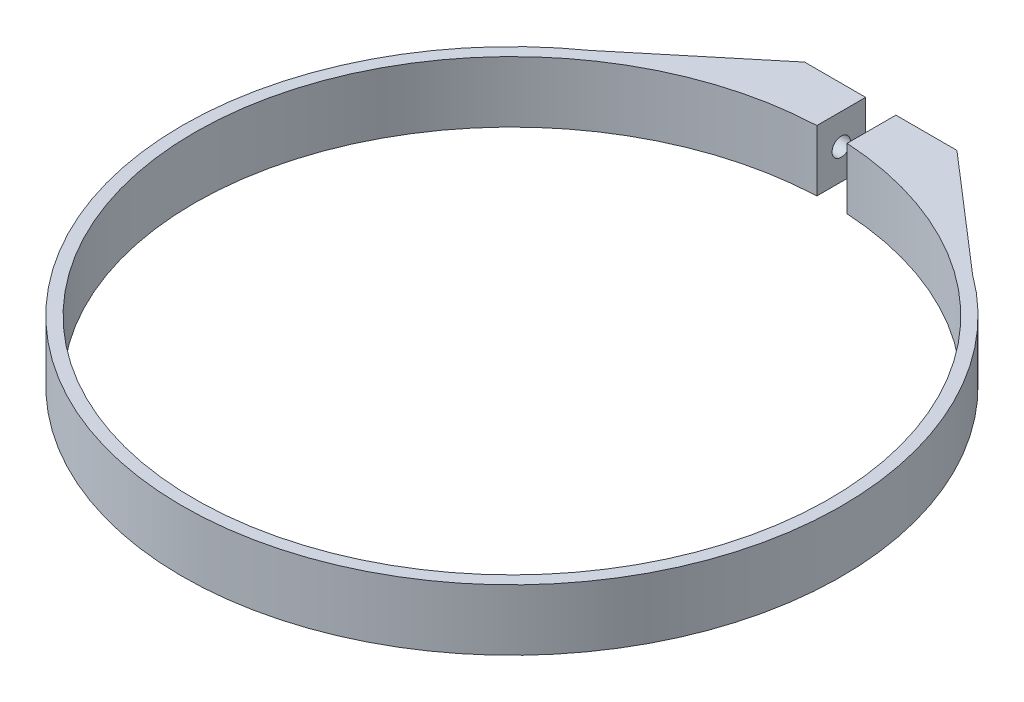
ISO-10303-21;
HEADER;
FILE_DESCRIPTION(('STEP AP214'),'2;1');
FILE_NAME('part.step','',(''),(''),'','','');
FILE_SCHEMA(('AUTOMOTIVE_DESIGN { 1 0 10303 214 1 1 1 1 }'));
ENDSEC;
DATA;
#1=APPLICATION_CONTEXT('core data for automotive mechanical design processes');
#2=APPLICATION_PROTOCOL_DEFINITION('international standard','automotive_design',2000,#1);
#3=PRODUCT_CONTEXT('',#1,'mechanical');
#4=PRODUCT('Part','Part','',(#3));
#5=PRODUCT_RELATED_PRODUCT_CATEGORY('part','',(#4));
#6=PRODUCT_DEFINITION_FORMATION('','',#4);
#7=PRODUCT_DEFINITION_CONTEXT('part definition',#1,'design');
#8=PRODUCT_DEFINITION('design','',#6,#7);
#9=PRODUCT_DEFINITION_SHAPE('','',#8);
#10=(LENGTH_UNIT() NAMED_UNIT(*) SI_UNIT(.MILLI.,.METRE.));
#11=(NAMED_UNIT(*) PLANE_ANGLE_UNIT() SI_UNIT($,.RADIAN.));
#12=(NAMED_UNIT(*) SI_UNIT($,.STERADIAN.) SOLID_ANGLE_UNIT());
#13=UNCERTAINTY_MEASURE_WITH_UNIT(LENGTH_MEASURE(1.E-05),#10,'distance_accuracy_value','');
#14=(GEOMETRIC_REPRESENTATION_CONTEXT(3) GLOBAL_UNCERTAINTY_ASSIGNED_CONTEXT((#13)) GLOBAL_UNIT_ASSIGNED_CONTEXT((#10,
#11,#12)) REPRESENTATION_CONTEXT('',''));
#15=CARTESIAN_POINT('',(0.,0.,0.));
#16=DIRECTION('',(0.,0.,1.));
#17=DIRECTION('',(1.,0.,0.));
#18=AXIS2_PLACEMENT_3D('',#15,#16,#17);
#19=CARTESIAN_POINT('',(12.9897228621849,0.,-59.9139822900086));
#20=DIRECTION('',(0.,0.,-1.));
#21=DIRECTION('',(-1.,0.,0.));
#22=AXIS2_PLACEMENT_3D('',#19,#20,#21);
#23=PLANE('',#22);
#24=DIRECTION('',(-1.,0.,0.));
#25=VECTOR('',#24,1.);
#26=CARTESIAN_POINT('',(12.9897228621849,10.,-59.9139822900086));
#27=LINE('',#26,#25);
#28=CARTESIAN_POINT('',(12.9897228621849,10.,-59.9139822900086));
#29=VERTEX_POINT('',#28);
#30=CARTESIAN_POINT('',(2.98972286218493,10.,-59.9139822900086));
#31=VERTEX_POINT('',#30);
#32=EDGE_CURVE('E125',#29,#31,#27,.T.);
#33=ORIENTED_EDGE('',*,*,#32,.F.);
#34=DIRECTION('',(0.,1.,0.));
#35=VECTOR('',#34,1.);
#36=CARTESIAN_POINT('',(12.9897228621849,0.,-59.9139822900086));
#37=LINE('',#36,#35);
#38=CARTESIAN_POINT('',(12.9897228621849,0.,-59.9139822900086));
#39=VERTEX_POINT('',#38);
#40=EDGE_CURVE('E11',#39,#29,#37,.T.);
#41=ORIENTED_EDGE('',*,*,#40,.F.);
#42=DIRECTION('',(-1.,0.,0.));
#43=VECTOR('',#42,1.);
#44=CARTESIAN_POINT('',(12.9897228621849,0.,-59.9139822900086));
#45=LINE('',#44,#43);
#46=CARTESIAN_POINT('',(2.98972286218493,0.,-59.9139822900086));
#47=VERTEX_POINT('',#46);
#48=EDGE_CURVE('E143',#39,#47,#45,.T.);
#49=ORIENTED_EDGE('',*,*,#48,.T.);
#50=DIRECTION('',(0.,1.,0.));
#51=VECTOR('',#50,1.);
#52=CARTESIAN_POINT('',(2.98972286218493,0.,-59.9139822900086));
#53=LINE('',#52,#51);
#54=EDGE_CURVE('E86',#47,#31,#53,.T.);
#55=ORIENTED_EDGE('',*,*,#54,.T.);
#56=EDGE_LOOP('',(#33,#41,#49,#55));
#57=FACE_BOUND('',#56,.T.);
#58=ADVANCED_FACE('F32',(#57),#23,.T.);
#59=CARTESIAN_POINT('',(31.9047371873834,0.,-43.5670488443273));
#60=DIRECTION('',(0.653877337827255,0.,-0.756600573007939));
#61=DIRECTION('',(-0.756600573007939,0.,-0.653877337827255));
#62=AXIS2_PLACEMENT_3D('',#59,#60,#61);
#63=PLANE('',#62);
#64=CARTESIAN_POINT('',(17.5635655673492,5.,-55.9611276420093));
#65=DIRECTION('',(0.653877337827255,0.,-0.756600573007939));
#66=DIRECTION('',(-0.756600573007939,0.,-0.653877337827255));
#67=AXIS2_PLACEMENT_3D('',#64,#65,#66);
#68=ELLIPSE('',#67,2.29400823858538,1.5);
#69=CARTESIAN_POINT('',(15.8279176195506,5.,-57.4611276420093));
#70=VERTEX_POINT('',#69);
#71=EDGE_CURVE('E156',#70,#70,#68,.T.);
#72=ORIENTED_EDGE('',*,*,#71,.F.);
#73=EDGE_LOOP('',(#72));
#74=FACE_BOUND('',#73,.T.);
#75=DIRECTION('',(-0.756600573007939,0.,-0.653877337827255));
#76=VECTOR('',#75,1.);
#77=CARTESIAN_POINT('',(31.9047371873834,10.,-43.5670488443273));
#78=LINE('',#77,#76);
#79=CARTESIAN_POINT('',(31.9047371873834,10.,-43.5670488443273));
#80=VERTEX_POINT('',#79);
#81=EDGE_CURVE('E141',#80,#29,#78,.T.);
#82=ORIENTED_EDGE('',*,*,#81,.F.);
#83=DIRECTION('',(0.,1.,0.));
#84=VECTOR('',#83,1.);
#85=CARTESIAN_POINT('',(31.9047371873834,0.,-43.5670488443273));
#86=LINE('',#85,#84);
#87=CARTESIAN_POINT('',(31.9047371873834,0.,-43.5670488443273));
#88=VERTEX_POINT('',#87);
#89=EDGE_CURVE('E41',#88,#80,#86,.T.);
#90=ORIENTED_EDGE('',*,*,#89,.F.);
#91=DIRECTION('',(-0.756600573007939,0.,-0.653877337827255));
#92=VECTOR('',#91,1.);
#93=CARTESIAN_POINT('',(31.9047371873834,0.,-43.5670488443273));
#94=LINE('',#93,#92);
#95=EDGE_CURVE('E115',#88,#39,#94,.T.);
#96=ORIENTED_EDGE('',*,*,#95,.T.);
#97=ORIENTED_EDGE('',*,*,#40,.T.);
#98=EDGE_LOOP('',(#82,#90,#96,#97));
#99=FACE_BOUND('',#98,.T.);
#100=ADVANCED_FACE('F197',(#74,#99),#63,.T.);
#101=CARTESIAN_POINT('',(0.,0.,0.));
#102=DIRECTION('',(0.,1.,0.));
#103=DIRECTION('',(0.,0.,1.));
#104=AXIS2_PLACEMENT_3D('',#101,#102,#103);
#105=CYLINDRICAL_SURFACE('',#104,54.);
#106=CARTESIAN_POINT('',(0.,10.,0.));
#107=DIRECTION('',(0.,1.,0.));
#108=DIRECTION('',(0.,0.,1.));
#109=AXIS2_PLACEMENT_3D('',#106,#107,#108);
#110=CIRCLE('',#109,54.);
#111=CARTESIAN_POINT('',(-31.2716025724827,10.,-44.0237080735902));
#112=VERTEX_POINT('',#111);
#113=EDGE_CURVE('E101',#112,#80,#110,.T.);
#114=ORIENTED_EDGE('',*,*,#113,.F.);
#115=DIRECTION('',(0.,1.,0.));
#116=VECTOR('',#115,1.);
#117=CARTESIAN_POINT('',(-31.2716025724827,0.,-44.0237080735902));
#118=LINE('',#117,#116);
#119=CARTESIAN_POINT('',(-31.2716025724827,0.,-44.0237080735902));
#120=VERTEX_POINT('',#119);
#121=EDGE_CURVE('E96',#120,#112,#118,.T.);
#122=ORIENTED_EDGE('',*,*,#121,.F.);
#123=CARTESIAN_POINT('',(0.,0.,0.));
#124=DIRECTION('',(0.,1.,0.));
#125=DIRECTION('',(0.,0.,1.));
#126=AXIS2_PLACEMENT_3D('',#123,#124,#125);
#127=CIRCLE('',#126,54.);
#128=EDGE_CURVE('E99',#120,#88,#127,.T.);
#129=ORIENTED_EDGE('',*,*,#128,.T.);
#130=ORIENTED_EDGE('',*,*,#89,.T.);
#131=EDGE_LOOP('',(#114,#122,#129,#130));
#132=FACE_BOUND('',#131,.T.);
#133=ADVANCED_FACE('F98',(#132),#105,.T.);
#134=CARTESIAN_POINT('',(-12.0102771378151,0.,-59.9611276420093));
#135=DIRECTION('',(-0.637496782736761,0.,-0.770453017386705));
#136=DIRECTION('',(-0.770453017386705,0.,0.637496782736761));
#137=AXIS2_PLACEMENT_3D('',#134,#135,#136);
#138=PLANE('',#137);
#139=CARTESIAN_POINT('',(-16.8445165457642,5.,-55.9611276420093));
#140=DIRECTION('',(-0.637496782736761,0.,-0.770453017386705));
#141=DIRECTION('',(-0.770453017386705,0.,0.637496782736761));
#142=AXIS2_PLACEMENT_3D('',#139,#140,#141);
#143=ELLIPSE('',#142,3.92158841848197,2.5);
#144=CARTESIAN_POINT('',(-19.8659161757324,5.,-53.4611276420093));
#145=VERTEX_POINT('',#144);
#146=EDGE_CURVE('E35',#145,#145,#143,.T.);
#147=ORIENTED_EDGE('',*,*,#146,.F.);
#148=EDGE_LOOP('',(#147));
#149=FACE_BOUND('',#148,.T.);
#150=DIRECTION('',(-0.770453017386705,0.,0.637496782736761));
#151=VECTOR('',#150,1.);
#152=CARTESIAN_POINT('',(-12.0102771378151,10.,-59.9611276420093));
#153=LINE('',#152,#151);
#154=CARTESIAN_POINT('',(-12.0102771378151,10.,-59.9611276420093));
#155=VERTEX_POINT('',#154);
#156=EDGE_CURVE('E138',#155,#112,#153,.T.);
#157=ORIENTED_EDGE('',*,*,#156,.F.);
#158=DIRECTION('',(0.,1.,0.));
#159=VECTOR('',#158,1.);
#160=CARTESIAN_POINT('',(-12.0102771378151,0.,-59.9611276420093));
#161=LINE('',#160,#159);
#162=CARTESIAN_POINT('',(-12.0102771378151,0.,-59.9611276420093));
#163=VERTEX_POINT('',#162);
#164=EDGE_CURVE('E106',#163,#155,#161,.T.);
#165=ORIENTED_EDGE('',*,*,#164,.F.);
#166=DIRECTION('',(-0.770453017386705,0.,0.637496782736761));
#167=VECTOR('',#166,1.);
#168=CARTESIAN_POINT('',(-12.0102771378151,0.,-59.9611276420093));
#169=LINE('',#168,#167);
#170=EDGE_CURVE('E113',#163,#120,#169,.T.);
#171=ORIENTED_EDGE('',*,*,#170,.T.);
#172=ORIENTED_EDGE('',*,*,#121,.T.);
#173=EDGE_LOOP('',(#157,#165,#171,#172));
#174=FACE_BOUND('',#173,.T.);
#175=ADVANCED_FACE('F117',(#149,#174),#138,.T.);
#176=CARTESIAN_POINT('',(-2.01027713781507,0.,-59.9611276420093));
#177=DIRECTION('',(0.,0.,-1.));
#178=DIRECTION('',(-1.,0.,0.));
#179=AXIS2_PLACEMENT_3D('',#176,#177,#178);
#180=PLANE('',#179);
#181=DIRECTION('',(-1.,0.,0.));
#182=VECTOR('',#181,1.);
#183=CARTESIAN_POINT('',(-2.01027713781507,10.,-59.9611276420093));
#184=LINE('',#183,#182);
#185=CARTESIAN_POINT('',(-2.01027713781507,10.,-59.9611276420093));
#186=VERTEX_POINT('',#185);
#187=EDGE_CURVE('E135',#186,#155,#184,.T.);
#188=ORIENTED_EDGE('',*,*,#187,.F.);
#189=DIRECTION('',(0.,1.,0.));
#190=VECTOR('',#189,1.);
#191=CARTESIAN_POINT('',(-2.01027713781507,0.,-59.9611276420093));
#192=LINE('',#191,#190);
#193=CARTESIAN_POINT('',(-2.01027713781507,0.,-59.9611276420093));
#194=VERTEX_POINT('',#193);
#195=EDGE_CURVE('E147',#194,#186,#192,.T.);
#196=ORIENTED_EDGE('',*,*,#195,.F.);
#197=DIRECTION('',(-1.,0.,0.));
#198=VECTOR('',#197,1.);
#199=CARTESIAN_POINT('',(-2.01027713781507,0.,-59.9611276420093));
#200=LINE('',#199,#198);
#201=EDGE_CURVE('E118',#194,#163,#200,.T.);
#202=ORIENTED_EDGE('',*,*,#201,.T.);
#203=ORIENTED_EDGE('',*,*,#164,.T.);
#204=EDGE_LOOP('',(#188,#196,#202,#203));
#205=FACE_BOUND('',#204,.T.);
#206=ADVANCED_FACE('F212',(#205),#180,.T.);
#207=CARTESIAN_POINT('',(-2.01027713781506,0.,-51.9611276420093));
#208=DIRECTION('',(1.,0.,0.));
#209=DIRECTION('',(0.,0.,-1.));
#210=AXIS2_PLACEMENT_3D('',#207,#208,#209);
#211=PLANE('',#210);
#212=CARTESIAN_POINT('',(-2.01027713781506,5.,-55.9611276420093));
#213=DIRECTION('',(1.,0.,0.));
#214=DIRECTION('',(0.,0.,-1.));
#215=AXIS2_PLACEMENT_3D('',#212,#213,#214);
#216=CIRCLE('',#215,1.5);
#217=CARTESIAN_POINT('',(-2.01027713781506,5.,-57.4611276420093));
#218=VERTEX_POINT('',#217);
#219=EDGE_CURVE('E161',#218,#218,#216,.T.);
#220=ORIENTED_EDGE('',*,*,#219,.F.);
#221=EDGE_LOOP('',(#220));
#222=FACE_BOUND('',#221,.T.);
#223=DIRECTION('',(0.,0.,-1.));
#224=VECTOR('',#223,1.);
#225=CARTESIAN_POINT('',(-2.01027713781506,10.,-51.9611276420093));
#226=LINE('',#225,#224);
#227=CARTESIAN_POINT('',(-2.01027713781506,10.,-51.9611276420093));
#228=VERTEX_POINT('',#227);
#229=EDGE_CURVE('E132',#228,#186,#226,.T.);
#230=ORIENTED_EDGE('',*,*,#229,.F.);
#231=DIRECTION('',(0.,1.,0.));
#232=VECTOR('',#231,1.);
#233=CARTESIAN_POINT('',(-2.01027713781506,0.,-51.9611276420093));
#234=LINE('',#233,#232);
#235=CARTESIAN_POINT('',(-2.01027713781506,0.,-51.9611276420093));
#236=VERTEX_POINT('',#235);
#237=EDGE_CURVE('E149',#236,#228,#234,.T.);
#238=ORIENTED_EDGE('',*,*,#237,.F.);
#239=DIRECTION('',(0.,0.,-1.));
#240=VECTOR('',#239,1.);
#241=CARTESIAN_POINT('',(-2.01027713781506,0.,-51.9611276420093));
#242=LINE('',#241,#240);
#243=EDGE_CURVE('E120',#236,#194,#242,.T.);
#244=ORIENTED_EDGE('',*,*,#243,.T.);
#245=ORIENTED_EDGE('',*,*,#195,.T.);
#246=EDGE_LOOP('',(#230,#238,#244,#245));
#247=FACE_BOUND('',#246,.T.);
#248=ADVANCED_FACE('F184',(#222,#247),#211,.T.);
#249=CARTESIAN_POINT('',(2.98972286218493,0.,-59.9139822900086));
#250=DIRECTION('',(-1.,0.,0.));
#251=DIRECTION('',(0.,0.,1.));
#252=AXIS2_PLACEMENT_3D('',#249,#250,#251);
#253=PLANE('',#252);
#254=CARTESIAN_POINT('',(2.98972286218493,5.,-55.9611276420093));
#255=DIRECTION('',(-1.,0.,0.));
#256=DIRECTION('',(0.,0.,1.));
#257=AXIS2_PLACEMENT_3D('',#254,#255,#256);
#258=CIRCLE('',#257,1.5);
#259=CARTESIAN_POINT('',(2.98972286218493,5.,-54.4611276420093));
#260=VERTEX_POINT('',#259);
#261=EDGE_CURVE('E154',#260,#260,#258,.T.);
#262=ORIENTED_EDGE('',*,*,#261,.F.);
#263=EDGE_LOOP('',(#262));
#264=FACE_BOUND('',#263,.T.);
#265=DIRECTION('',(0.,0.,1.));
#266=VECTOR('',#265,1.);
#267=CARTESIAN_POINT('',(2.98972286218493,10.,-59.9139822900086));
#268=LINE('',#267,#266);
#269=CARTESIAN_POINT('',(2.98972286218493,10.,-51.9139822900086));
#270=VERTEX_POINT('',#269);
#271=EDGE_CURVE('E128',#31,#270,#268,.T.);
#272=ORIENTED_EDGE('',*,*,#271,.F.);
#273=ORIENTED_EDGE('',*,*,#54,.F.);
#274=DIRECTION('',(0.,0.,1.));
#275=VECTOR('',#274,1.);
#276=CARTESIAN_POINT('',(2.98972286218493,0.,-59.9139822900086));
#277=LINE('',#276,#275);
#278=CARTESIAN_POINT('',(2.98972286218493,0.,-51.9139822900086));
#279=VERTEX_POINT('',#278);
#280=EDGE_CURVE('E179',#47,#279,#277,.T.);
#281=ORIENTED_EDGE('',*,*,#280,.T.);
#282=DIRECTION('',(0.,1.,0.));
#283=VECTOR('',#282,1.);
#284=CARTESIAN_POINT('',(2.98972286218493,0.,-51.9139822900086));
#285=LINE('',#284,#283);
#286=EDGE_CURVE('E151',#279,#270,#285,.T.);
#287=ORIENTED_EDGE('',*,*,#286,.T.);
#288=EDGE_LOOP('',(#272,#273,#281,#287));
#289=FACE_BOUND('',#288,.T.);
#290=ADVANCED_FACE('F195',(#264,#289),#253,.T.);
#291=CARTESIAN_POINT('',(0.,0.,0.));
#292=DIRECTION('',(0.,1.,0.));
#293=DIRECTION('',(0.,0.,1.));
#294=AXIS2_PLACEMENT_3D('',#291,#292,#293);
#295=PLANE('',#294);
#296=ORIENTED_EDGE('',*,*,#243,.F.);
#297=CARTESIAN_POINT('',(0.,0.,0.));
#298=DIRECTION('',(0.,-1.,0.));
#299=DIRECTION('',(0.,0.,-1.));
#300=AXIS2_PLACEMENT_3D('',#297,#298,#299);
#301=CIRCLE('',#300,52.);
#302=EDGE_CURVE('E173',#279,#236,#301,.T.);
#303=ORIENTED_EDGE('',*,*,#302,.F.);
#304=ORIENTED_EDGE('',*,*,#280,.F.);
#305=ORIENTED_EDGE('',*,*,#48,.F.);
#306=ORIENTED_EDGE('',*,*,#95,.F.);
#307=ORIENTED_EDGE('',*,*,#128,.F.);
#308=ORIENTED_EDGE('',*,*,#170,.F.);
#309=ORIENTED_EDGE('',*,*,#201,.F.);
#310=EDGE_LOOP('',(#296,#303,#304,#305,#306,#307,#308,#309));
#311=FACE_BOUND('',#310,.T.);
#312=ADVANCED_FACE('F111',(#311),#295,.F.);
#313=CARTESIAN_POINT('',(0.,10.,0.));
#314=DIRECTION('',(0.,1.,0.));
#315=DIRECTION('',(0.,0.,1.));
#316=AXIS2_PLACEMENT_3D('',#313,#314,#315);
#317=PLANE('',#316);
#318=CARTESIAN_POINT('',(0.,10.,0.));
#319=DIRECTION('',(0.,-1.,0.));
#320=DIRECTION('',(0.,0.,-1.));
#321=AXIS2_PLACEMENT_3D('',#318,#319,#320);
#322=CIRCLE('',#321,52.);
#323=EDGE_CURVE('E129',#270,#228,#322,.T.);
#324=ORIENTED_EDGE('',*,*,#323,.T.);
#325=ORIENTED_EDGE('',*,*,#229,.T.);
#326=ORIENTED_EDGE('',*,*,#187,.T.);
#327=ORIENTED_EDGE('',*,*,#156,.T.);
#328=ORIENTED_EDGE('',*,*,#113,.T.);
#329=ORIENTED_EDGE('',*,*,#81,.T.);
#330=ORIENTED_EDGE('',*,*,#32,.T.);
#331=ORIENTED_EDGE('',*,*,#271,.T.);
#332=EDGE_LOOP('',(#324,#325,#326,#327,#328,#329,#330,#331));
#333=FACE_BOUND('',#332,.T.);
#334=ADVANCED_FACE('F196',(#333),#317,.T.);
#335=CARTESIAN_POINT('',(0.,10.,0.));
#336=DIRECTION('',(0.,-1.,0.));
#337=DIRECTION('',(0.,0.,-1.));
#338=AXIS2_PLACEMENT_3D('',#335,#336,#337);
#339=CYLINDRICAL_SURFACE('',#338,52.);
#340=ORIENTED_EDGE('',*,*,#237,.T.);
#341=ORIENTED_EDGE('',*,*,#323,.F.);
#342=ORIENTED_EDGE('',*,*,#286,.F.);
#343=ORIENTED_EDGE('',*,*,#302,.T.);
#344=EDGE_LOOP('',(#340,#341,#342,#343));
#345=FACE_BOUND('',#344,.T.);
#346=ADVANCED_FACE('F193',(#345),#339,.F.);
#347=CARTESIAN_POINT('',(-19.8659161757324,5.,-55.9611276420093));
#348=DIRECTION('',(-1.,0.,0.));
#349=DIRECTION('',(0.,0.,1.));
#350=AXIS2_PLACEMENT_3D('',#347,#348,#349);
#351=CYLINDRICAL_SURFACE('',#350,1.5);
#352=ORIENTED_EDGE('',*,*,#71,.T.);
#353=EDGE_LOOP('',(#352));
#354=FACE_BOUND('',#353,.T.);
#355=ORIENTED_EDGE('',*,*,#261,.T.);
#356=EDGE_LOOP('',(#355));
#357=FACE_BOUND('',#356,.T.);
#358=ADVANCED_FACE('F230',(#354,#357),#351,.F.);
#359=ORIENTED_EDGE('',*,*,#219,.T.);
#360=EDGE_LOOP('',(#359));
#361=FACE_BOUND('',#360,.T.);
#362=CARTESIAN_POINT('',(-7.01027713781507,5.,-55.9611276420093));
#363=DIRECTION('',(-1.,0.,0.));
#364=DIRECTION('',(0.,0.,1.));
#365=AXIS2_PLACEMENT_3D('',#362,#363,#364);
#366=CIRCLE('',#365,1.50000000000001);
#367=CARTESIAN_POINT('',(-7.01027713781507,5.,-54.4611276420093));
#368=VERTEX_POINT('',#367);
#369=EDGE_CURVE('E157',#368,#368,#366,.T.);
#370=ORIENTED_EDGE('',*,*,#369,.T.);
#371=EDGE_LOOP('',(#370));
#372=FACE_BOUND('',#371,.T.);
#373=ADVANCED_FACE('F233',(#361,#372),#351,.F.);
#374=CARTESIAN_POINT('',(-7.01027713781507,6.50000000000001,-55.9611276420093));
#375=DIRECTION('',(1.,0.,0.));
#376=DIRECTION('',(0.,0.,-1.));
#377=AXIS2_PLACEMENT_3D('',#374,#375,#376);
#378=PLANE('',#377);
#379=ORIENTED_EDGE('',*,*,#369,.F.);
#380=EDGE_LOOP('',(#379));
#381=FACE_BOUND('',#380,.T.);
#382=CARTESIAN_POINT('',(-7.01027713781507,5.,-55.9611276420093));
#383=DIRECTION('',(-1.,0.,0.));
#384=DIRECTION('',(0.,0.,1.));
#385=AXIS2_PLACEMENT_3D('',#382,#383,#384);
#386=CIRCLE('',#385,2.5);
#387=CARTESIAN_POINT('',(-7.01027713781507,5.,-53.4611276420093));
#388=VERTEX_POINT('',#387);
#389=EDGE_CURVE('E164',#388,#388,#386,.T.);
#390=ORIENTED_EDGE('',*,*,#389,.T.);
#391=EDGE_LOOP('',(#390));
#392=FACE_BOUND('',#391,.T.);
#393=ADVANCED_FACE('F235',(#381,#392),#378,.F.);
#394=CARTESIAN_POINT('',(-19.8659161757324,5.,-55.9611276420093));
#395=DIRECTION('',(-1.,0.,0.));
#396=DIRECTION('',(0.,0.,1.));
#397=AXIS2_PLACEMENT_3D('',#394,#395,#396);
#398=CYLINDRICAL_SURFACE('',#397,2.5);
#399=ORIENTED_EDGE('',*,*,#146,.T.);
#400=EDGE_LOOP('',(#399));
#401=FACE_BOUND('',#400,.T.);
#402=ORIENTED_EDGE('',*,*,#389,.F.);
#403=EDGE_LOOP('',(#402));
#404=FACE_BOUND('',#403,.T.);
#405=ADVANCED_FACE('F238',(#401,#404),#398,.F.);
#406=CLOSED_SHELL('',(#58,#100,#133,#175,#206,#248,#290,#312,#334,#346,#358,#373,#393,#405));
#407=MANIFOLD_SOLID_BREP('B2',#406);
#408=ADVANCED_BREP_SHAPE_REPRESENTATION('',(#18,#407),#14);
#409=SHAPE_DEFINITION_REPRESENTATION(#9,#408);
ENDSEC;
END-ISO-10303-21;
